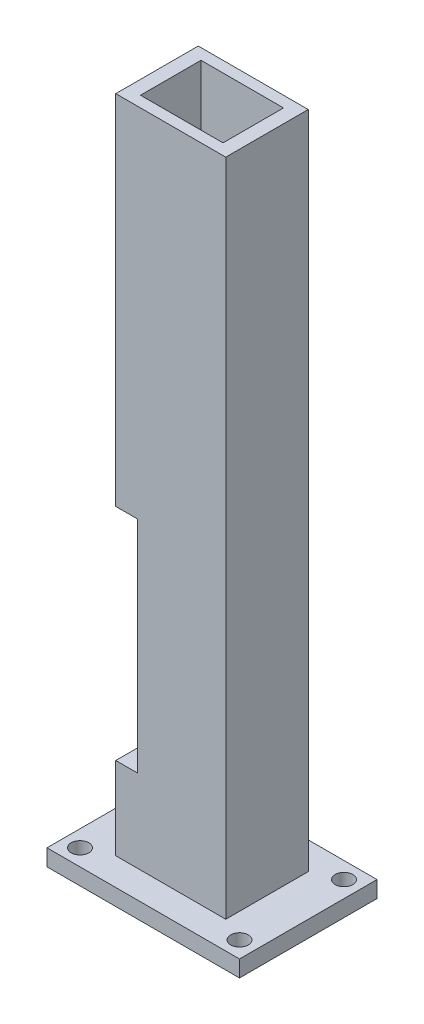
ISO-10303-21;
HEADER;
FILE_DESCRIPTION(('STEP AP214'),'2;1');
FILE_NAME('part.step','',(''),(''),'','','');
FILE_SCHEMA(('AUTOMOTIVE_DESIGN { 1 0 10303 214 1 1 1 1 }'));
ENDSEC;
DATA;
#1=APPLICATION_CONTEXT('core data for automotive mechanical design processes');
#2=APPLICATION_PROTOCOL_DEFINITION('international standard','automotive_design',2000,#1);
#3=PRODUCT_CONTEXT('',#1,'mechanical');
#4=PRODUCT('Part','Part','',(#3));
#5=PRODUCT_RELATED_PRODUCT_CATEGORY('part','',(#4));
#6=PRODUCT_DEFINITION_FORMATION('','',#4);
#7=PRODUCT_DEFINITION_CONTEXT('part definition',#1,'design');
#8=PRODUCT_DEFINITION('design','',#6,#7);
#9=PRODUCT_DEFINITION_SHAPE('','',#8);
#10=(LENGTH_UNIT() NAMED_UNIT(*) SI_UNIT(.MILLI.,.METRE.));
#11=(NAMED_UNIT(*) PLANE_ANGLE_UNIT() SI_UNIT($,.RADIAN.));
#12=(NAMED_UNIT(*) SI_UNIT($,.STERADIAN.) SOLID_ANGLE_UNIT());
#13=UNCERTAINTY_MEASURE_WITH_UNIT(LENGTH_MEASURE(1.E-05),#10,'distance_accuracy_value','');
#14=(GEOMETRIC_REPRESENTATION_CONTEXT(3) GLOBAL_UNCERTAINTY_ASSIGNED_CONTEXT((#13)) GLOBAL_UNIT_ASSIGNED_CONTEXT((#10,
#11,#12)) REPRESENTATION_CONTEXT('',''));
#15=CARTESIAN_POINT('',(0.,0.,0.));
#16=DIRECTION('',(0.,0.,1.));
#17=DIRECTION('',(1.,0.,0.));
#18=AXIS2_PLACEMENT_3D('',#15,#16,#17);
#19=CARTESIAN_POINT('',(-10.,123.,7.5));
#20=DIRECTION('',(1.,0.,0.));
#21=DIRECTION('',(0.,0.,-1.));
#22=AXIS2_PLACEMENT_3D('',#19,#20,#21);
#23=PLANE('',#22);
#24=DIRECTION('',(0.,-1.,0.));
#25=VECTOR('',#24,1.);
#26=CARTESIAN_POINT('',(-10.,123.,-7.5));
#27=LINE('',#26,#25);
#28=CARTESIAN_POINT('',(-10.,123.,-7.5));
#29=VERTEX_POINT('',#28);
#30=CARTESIAN_POINT('',(-10.,58.,-7.5));
#31=VERTEX_POINT('',#30);
#32=EDGE_CURVE('E201',#29,#31,#27,.T.);
#33=ORIENTED_EDGE('',*,*,#32,.T.);
#34=DIRECTION('',(0.,0.,1.));
#35=VECTOR('',#34,1.);
#36=CARTESIAN_POINT('',(-10.,58.,-12.501));
#37=LINE('',#36,#35);
#38=CARTESIAN_POINT('',(-10.,58.,7.5));
#39=VERTEX_POINT('',#38);
#40=EDGE_CURVE('E579',#31,#39,#37,.T.);
#41=ORIENTED_EDGE('',*,*,#40,.T.);
#42=DIRECTION('',(0.,-1.,0.));
#43=VECTOR('',#42,1.);
#44=CARTESIAN_POINT('',(-10.,123.,7.5));
#45=LINE('',#44,#43);
#46=CARTESIAN_POINT('',(-10.,123.,7.5));
#47=VERTEX_POINT('',#46);
#48=EDGE_CURVE('E202',#47,#39,#45,.T.);
#49=ORIENTED_EDGE('',*,*,#48,.F.);
#50=DIRECTION('',(0.,0.,1.));
#51=VECTOR('',#50,1.);
#52=CARTESIAN_POINT('',(-10.,123.,7.5));
#53=LINE('',#52,#51);
#54=EDGE_CURVE('E632',#29,#47,#53,.T.);
#55=ORIENTED_EDGE('',*,*,#54,.F.);
#56=EDGE_LOOP('',(#33,#41,#49,#55));
#57=FACE_BOUND('',#56,.T.);
#58=ADVANCED_FACE('F41',(#57),#23,.F.);
#59=CARTESIAN_POINT('',(-7.5,-0.001000000000001,5.5));
#60=DIRECTION('',(-1.,0.,0.));
#61=DIRECTION('',(0.,0.,1.));
#62=AXIS2_PLACEMENT_3D('',#59,#60,#61);
#63=PLANE('',#62);
#64=DIRECTION('',(0.,1.,0.));
#65=VECTOR('',#64,1.);
#66=CARTESIAN_POINT('',(-7.5,-0.001000000000001,5.5));
#67=LINE('',#66,#65);
#68=CARTESIAN_POINT('',(-7.5,58.,5.5));
#69=VERTEX_POINT('',#68);
#70=CARTESIAN_POINT('',(-7.5,123.,5.5));
#71=VERTEX_POINT('',#70);
#72=EDGE_CURVE('E616',#69,#71,#67,.T.);
#73=ORIENTED_EDGE('',*,*,#72,.F.);
#74=DIRECTION('',(0.,0.,1.));
#75=VECTOR('',#74,1.);
#76=CARTESIAN_POINT('',(-7.5,58.,-12.501));
#77=LINE('',#76,#75);
#78=CARTESIAN_POINT('',(-7.5,58.,-5.5));
#79=VERTEX_POINT('',#78);
#80=EDGE_CURVE('E560',#79,#69,#77,.T.);
#81=ORIENTED_EDGE('',*,*,#80,.F.);
#82=DIRECTION('',(0.,1.,0.));
#83=VECTOR('',#82,1.);
#84=CARTESIAN_POINT('',(-7.5,-0.001000000000001,-5.5));
#85=LINE('',#84,#83);
#86=CARTESIAN_POINT('',(-7.5,123.,-5.5));
#87=VERTEX_POINT('',#86);
#88=EDGE_CURVE('E620',#79,#87,#85,.T.);
#89=ORIENTED_EDGE('',*,*,#88,.T.);
#90=DIRECTION('',(0.,0.,1.));
#91=VECTOR('',#90,1.);
#92=CARTESIAN_POINT('',(-7.5,123.,5.5));
#93=LINE('',#92,#91);
#94=EDGE_CURVE('E603',#87,#71,#93,.T.);
#95=ORIENTED_EDGE('',*,*,#94,.T.);
#96=EDGE_LOOP('',(#73,#81,#89,#95));
#97=FACE_BOUND('',#96,.T.);
#98=ADVANCED_FACE('F264',(#97),#63,.F.);
#99=CARTESIAN_POINT('',(0.,3.,0.));
#100=DIRECTION('',(0.,-1.,0.));
#101=DIRECTION('',(0.,0.,-1.));
#102=AXIS2_PLACEMENT_3D('',#99,#100,#101);
#103=PLANE('',#102);
#104=CARTESIAN_POINT('',(14.5,3.,-9.50000000000001));
#105=DIRECTION('',(0.,1.,0.));
#106=DIRECTION('',(0.,0.,1.));
#107=AXIS2_PLACEMENT_3D('',#104,#105,#106);
#108=CIRCLE('',#107,1.6);
#109=CARTESIAN_POINT('',(14.5,3.,-7.90000000000001));
#110=VERTEX_POINT('',#109);
#111=EDGE_CURVE('E537',#110,#110,#108,.T.);
#112=ORIENTED_EDGE('',*,*,#111,.F.);
#113=EDGE_LOOP('',(#112));
#114=FACE_BOUND('',#113,.T.);
#115=CARTESIAN_POINT('',(-14.5,3.,9.5));
#116=DIRECTION('',(0.,1.,0.));
#117=DIRECTION('',(0.,0.,1.));
#118=AXIS2_PLACEMENT_3D('',#115,#116,#117);
#119=CIRCLE('',#118,1.6);
#120=CARTESIAN_POINT('',(-14.5,3.,11.1));
#121=VERTEX_POINT('',#120);
#122=EDGE_CURVE('E543',#121,#121,#119,.T.);
#123=ORIENTED_EDGE('',*,*,#122,.F.);
#124=EDGE_LOOP('',(#123));
#125=FACE_BOUND('',#124,.T.);
#126=CARTESIAN_POINT('',(14.5,3.,9.5));
#127=DIRECTION('',(0.,1.,0.));
#128=DIRECTION('',(0.,0.,1.));
#129=AXIS2_PLACEMENT_3D('',#126,#127,#128);
#130=CIRCLE('',#129,1.6);
#131=CARTESIAN_POINT('',(14.5,3.,11.1));
#132=VERTEX_POINT('',#131);
#133=EDGE_CURVE('E681',#132,#132,#130,.T.);
#134=ORIENTED_EDGE('',*,*,#133,.F.);
#135=EDGE_LOOP('',(#134));
#136=FACE_BOUND('',#135,.T.);
#137=CARTESIAN_POINT('',(-14.5,3.,-9.5));
#138=DIRECTION('',(0.,1.,0.));
#139=DIRECTION('',(0.,0.,1.));
#140=AXIS2_PLACEMENT_3D('',#137,#138,#139);
#141=CIRCLE('',#140,1.6);
#142=CARTESIAN_POINT('',(-14.5,3.,-7.9));
#143=VERTEX_POINT('',#142);
#144=EDGE_CURVE('E550',#143,#143,#141,.T.);
#145=ORIENTED_EDGE('',*,*,#144,.F.);
#146=EDGE_LOOP('',(#145));
#147=FACE_BOUND('',#146,.T.);
#148=DIRECTION('',(0.,0.,-1.));
#149=VECTOR('',#148,1.);
#150=CARTESIAN_POINT('',(17.5,3.,12.5));
#151=LINE('',#150,#149);
#152=CARTESIAN_POINT('',(17.5,3.,12.5));
#153=VERTEX_POINT('',#152);
#154=CARTESIAN_POINT('',(17.5,3.,-12.5));
#155=VERTEX_POINT('',#154);
#156=EDGE_CURVE('E212',#153,#155,#151,.T.);
#157=ORIENTED_EDGE('',*,*,#156,.T.);
#158=DIRECTION('',(-1.,0.,0.));
#159=VECTOR('',#158,1.);
#160=CARTESIAN_POINT('',(-17.5,3.,-12.5));
#161=LINE('',#160,#159);
#162=CARTESIAN_POINT('',(-17.5,3.,-12.5));
#163=VERTEX_POINT('',#162);
#164=EDGE_CURVE('E215',#155,#163,#161,.T.);
#165=ORIENTED_EDGE('',*,*,#164,.T.);
#166=DIRECTION('',(0.,0.,1.));
#167=VECTOR('',#166,1.);
#168=CARTESIAN_POINT('',(-17.5,3.,12.5));
#169=LINE('',#168,#167);
#170=CARTESIAN_POINT('',(-17.5,3.,12.5));
#171=VERTEX_POINT('',#170);
#172=EDGE_CURVE('E218',#163,#171,#169,.T.);
#173=ORIENTED_EDGE('',*,*,#172,.T.);
#174=DIRECTION('',(1.,0.,0.));
#175=VECTOR('',#174,1.);
#176=CARTESIAN_POINT('',(-17.5,3.,12.5));
#177=LINE('',#176,#175);
#178=EDGE_CURVE('E220',#171,#153,#177,.T.);
#179=ORIENTED_EDGE('',*,*,#178,.T.);
#180=EDGE_LOOP('',(#157,#165,#173,#179));
#181=FACE_BOUND('',#180,.T.);
#182=DIRECTION('',(0.,0.,-1.));
#183=VECTOR('',#182,1.);
#184=CARTESIAN_POINT('',(10.,3.,7.5));
#185=LINE('',#184,#183);
#186=CARTESIAN_POINT('',(10.,3.,7.5));
#187=VERTEX_POINT('',#186);
#188=CARTESIAN_POINT('',(10.,3.,-7.5));
#189=VERTEX_POINT('',#188);
#190=EDGE_CURVE('E625',#187,#189,#185,.T.);
#191=ORIENTED_EDGE('',*,*,#190,.F.);
#192=DIRECTION('',(1.,0.,0.));
#193=VECTOR('',#192,1.);
#194=CARTESIAN_POINT('',(-10.,3.,7.5));
#195=LINE('',#194,#193);
#196=CARTESIAN_POINT('',(-10.,3.,7.5));
#197=VERTEX_POINT('',#196);
#198=EDGE_CURVE('E630',#197,#187,#195,.T.);
#199=ORIENTED_EDGE('',*,*,#198,.F.);
#200=DIRECTION('',(0.,0.,1.));
#201=VECTOR('',#200,1.);
#202=CARTESIAN_POINT('',(-10.,3.,7.5));
#203=LINE('',#202,#201);
#204=CARTESIAN_POINT('',(-10.,3.,-7.5));
#205=VERTEX_POINT('',#204);
#206=EDGE_CURVE('E640',#205,#197,#203,.T.);
#207=ORIENTED_EDGE('',*,*,#206,.F.);
#208=DIRECTION('',(-1.,0.,0.));
#209=VECTOR('',#208,1.);
#210=CARTESIAN_POINT('',(-10.,3.,-7.5));
#211=LINE('',#210,#209);
#212=EDGE_CURVE('E200',#189,#205,#211,.T.);
#213=ORIENTED_EDGE('',*,*,#212,.F.);
#214=EDGE_LOOP('',(#191,#199,#207,#213));
#215=FACE_BOUND('',#214,.T.);
#216=ADVANCED_FACE('F254',(#114,#125,#136,#147,#181,#215),#103,.F.);
#217=CARTESIAN_POINT('',(17.5,3.,12.5));
#218=DIRECTION('',(-1.,0.,0.));
#219=DIRECTION('',(0.,0.,1.));
#220=AXIS2_PLACEMENT_3D('',#217,#218,#219);
#221=PLANE('',#220);
#222=DIRECTION('',(0.,0.,-1.));
#223=VECTOR('',#222,1.);
#224=CARTESIAN_POINT('',(17.5,0.,12.5));
#225=LINE('',#224,#223);
#226=CARTESIAN_POINT('',(17.5,0.,12.5));
#227=VERTEX_POINT('',#226);
#228=CARTESIAN_POINT('',(17.5,0.,-12.5));
#229=VERTEX_POINT('',#228);
#230=EDGE_CURVE('E211',#227,#229,#225,.T.);
#231=ORIENTED_EDGE('',*,*,#230,.T.);
#232=DIRECTION('',(0.,-1.,0.));
#233=VECTOR('',#232,1.);
#234=CARTESIAN_POINT('',(17.5,3.,-12.5));
#235=LINE('',#234,#233);
#236=EDGE_CURVE('E11',#155,#229,#235,.T.);
#237=ORIENTED_EDGE('',*,*,#236,.F.);
#238=ORIENTED_EDGE('',*,*,#156,.F.);
#239=DIRECTION('',(0.,-1.,0.));
#240=VECTOR('',#239,1.);
#241=CARTESIAN_POINT('',(17.5,3.,12.5));
#242=LINE('',#241,#240);
#243=EDGE_CURVE('E222',#153,#227,#242,.T.);
#244=ORIENTED_EDGE('',*,*,#243,.T.);
#245=EDGE_LOOP('',(#231,#237,#238,#244));
#246=FACE_BOUND('',#245,.T.);
#247=ADVANCED_FACE('F43',(#246),#221,.F.);
#248=CARTESIAN_POINT('',(-17.5,3.,-12.5));
#249=DIRECTION('',(0.,0.,1.));
#250=DIRECTION('',(1.,0.,0.));
#251=AXIS2_PLACEMENT_3D('',#248,#249,#250);
#252=PLANE('',#251);
#253=DIRECTION('',(-1.,0.,0.));
#254=VECTOR('',#253,1.);
#255=CARTESIAN_POINT('',(-17.5,0.,-12.5));
#256=LINE('',#255,#254);
#257=CARTESIAN_POINT('',(-17.5,0.,-12.5));
#258=VERTEX_POINT('',#257);
#259=EDGE_CURVE('E225',#229,#258,#256,.T.);
#260=ORIENTED_EDGE('',*,*,#259,.T.);
#261=DIRECTION('',(0.,-1.,0.));
#262=VECTOR('',#261,1.);
#263=CARTESIAN_POINT('',(-17.5,3.,-12.5));
#264=LINE('',#263,#262);
#265=EDGE_CURVE('E49',#163,#258,#264,.T.);
#266=ORIENTED_EDGE('',*,*,#265,.F.);
#267=ORIENTED_EDGE('',*,*,#164,.F.);
#268=ORIENTED_EDGE('',*,*,#236,.T.);
#269=EDGE_LOOP('',(#260,#266,#267,#268));
#270=FACE_BOUND('',#269,.T.);
#271=ADVANCED_FACE('F256',(#270),#252,.F.);
#272=CARTESIAN_POINT('',(-17.5,3.,12.5));
#273=DIRECTION('',(1.,0.,0.));
#274=DIRECTION('',(0.,0.,-1.));
#275=AXIS2_PLACEMENT_3D('',#272,#273,#274);
#276=PLANE('',#275);
#277=DIRECTION('',(0.,0.,1.));
#278=VECTOR('',#277,1.);
#279=CARTESIAN_POINT('',(-17.5,0.,12.5));
#280=LINE('',#279,#278);
#281=CARTESIAN_POINT('',(-17.5,0.,12.5));
#282=VERTEX_POINT('',#281);
#283=EDGE_CURVE('E227',#258,#282,#280,.T.);
#284=ORIENTED_EDGE('',*,*,#283,.T.);
#285=DIRECTION('',(0.,-1.,0.));
#286=VECTOR('',#285,1.);
#287=CARTESIAN_POINT('',(-17.5,3.,12.5));
#288=LINE('',#287,#286);
#289=EDGE_CURVE('E232',#171,#282,#288,.T.);
#290=ORIENTED_EDGE('',*,*,#289,.F.);
#291=ORIENTED_EDGE('',*,*,#172,.F.);
#292=ORIENTED_EDGE('',*,*,#265,.T.);
#293=EDGE_LOOP('',(#284,#290,#291,#292));
#294=FACE_BOUND('',#293,.T.);
#295=ADVANCED_FACE('F239',(#294),#276,.F.);
#296=CARTESIAN_POINT('',(-17.5,3.,12.5));
#297=DIRECTION('',(0.,0.,-1.));
#298=DIRECTION('',(-1.,0.,0.));
#299=AXIS2_PLACEMENT_3D('',#296,#297,#298);
#300=PLANE('',#299);
#301=DIRECTION('',(1.,0.,0.));
#302=VECTOR('',#301,1.);
#303=CARTESIAN_POINT('',(-17.5,0.,12.5));
#304=LINE('',#303,#302);
#305=EDGE_CURVE('E216',#282,#227,#304,.T.);
#306=ORIENTED_EDGE('',*,*,#305,.T.);
#307=ORIENTED_EDGE('',*,*,#243,.F.);
#308=ORIENTED_EDGE('',*,*,#178,.F.);
#309=ORIENTED_EDGE('',*,*,#289,.T.);
#310=EDGE_LOOP('',(#306,#307,#308,#309));
#311=FACE_BOUND('',#310,.T.);
#312=ADVANCED_FACE('F248',(#311),#300,.F.);
#313=CARTESIAN_POINT('',(0.,0.,0.));
#314=DIRECTION('',(0.,-1.,0.));
#315=DIRECTION('',(0.,0.,-1.));
#316=AXIS2_PLACEMENT_3D('',#313,#314,#315);
#317=PLANE('',#316);
#318=CARTESIAN_POINT('',(14.5,0.,-9.50000000000001));
#319=DIRECTION('',(0.,-1.,0.));
#320=DIRECTION('',(0.,0.,-1.));
#321=AXIS2_PLACEMENT_3D('',#318,#319,#320);
#322=CIRCLE('',#321,1.6);
#323=CARTESIAN_POINT('',(14.5,0.,-7.90000000000001));
#324=VERTEX_POINT('',#323);
#325=EDGE_CURVE('E534',#324,#324,#322,.F.);
#326=ORIENTED_EDGE('',*,*,#325,.T.);
#327=EDGE_LOOP('',(#326));
#328=FACE_BOUND('',#327,.T.);
#329=CARTESIAN_POINT('',(-14.5,0.,9.5));
#330=DIRECTION('',(0.,-1.,0.));
#331=DIRECTION('',(0.,0.,-1.));
#332=AXIS2_PLACEMENT_3D('',#329,#330,#331);
#333=CIRCLE('',#332,1.6);
#334=CARTESIAN_POINT('',(-14.5,0.,11.1));
#335=VERTEX_POINT('',#334);
#336=EDGE_CURVE('E538',#335,#335,#333,.F.);
#337=ORIENTED_EDGE('',*,*,#336,.T.);
#338=EDGE_LOOP('',(#337));
#339=FACE_BOUND('',#338,.T.);
#340=CARTESIAN_POINT('',(14.5,0.,9.5));
#341=DIRECTION('',(0.,-1.,0.));
#342=DIRECTION('',(0.,0.,-1.));
#343=AXIS2_PLACEMENT_3D('',#340,#341,#342);
#344=CIRCLE('',#343,1.6);
#345=CARTESIAN_POINT('',(14.5,0.,11.1));
#346=VERTEX_POINT('',#345);
#347=EDGE_CURVE('E549',#346,#346,#344,.F.);
#348=ORIENTED_EDGE('',*,*,#347,.T.);
#349=EDGE_LOOP('',(#348));
#350=FACE_BOUND('',#349,.T.);
#351=CARTESIAN_POINT('',(-14.5,0.,-9.5));
#352=DIRECTION('',(0.,-1.,0.));
#353=DIRECTION('',(0.,0.,-1.));
#354=AXIS2_PLACEMENT_3D('',#351,#352,#353);
#355=CIRCLE('',#354,1.6);
#356=CARTESIAN_POINT('',(-14.5,0.,-7.9));
#357=VERTEX_POINT('',#356);
#358=EDGE_CURVE('E540',#357,#357,#355,.F.);
#359=ORIENTED_EDGE('',*,*,#358,.T.);
#360=EDGE_LOOP('',(#359));
#361=FACE_BOUND('',#360,.T.);
#362=DIRECTION('',(0.,0.,-1.));
#363=VECTOR('',#362,1.);
#364=CARTESIAN_POINT('',(7.5,0.,5.5));
#365=LINE('',#364,#363);
#366=CARTESIAN_POINT('',(7.5,0.,5.5));
#367=VERTEX_POINT('',#366);
#368=CARTESIAN_POINT('',(7.5,0.,-5.5));
#369=VERTEX_POINT('',#368);
#370=EDGE_CURVE('E595',#367,#369,#365,.T.);
#371=ORIENTED_EDGE('',*,*,#370,.T.);
#372=DIRECTION('',(-1.,0.,0.));
#373=VECTOR('',#372,1.);
#374=CARTESIAN_POINT('',(-7.5,0.,-5.5));
#375=LINE('',#374,#373);
#376=CARTESIAN_POINT('',(-7.5,0.,-5.5));
#377=VERTEX_POINT('',#376);
#378=EDGE_CURVE('E612',#369,#377,#375,.T.);
#379=ORIENTED_EDGE('',*,*,#378,.T.);
#380=DIRECTION('',(0.,0.,1.));
#381=VECTOR('',#380,1.);
#382=CARTESIAN_POINT('',(-7.5,0.,5.5));
#383=LINE('',#382,#381);
#384=CARTESIAN_POINT('',(-7.5,0.,5.5));
#385=VERTEX_POINT('',#384);
#386=EDGE_CURVE('E184',#377,#385,#383,.T.);
#387=ORIENTED_EDGE('',*,*,#386,.T.);
#388=DIRECTION('',(1.,0.,0.));
#389=VECTOR('',#388,1.);
#390=CARTESIAN_POINT('',(-7.5,0.,5.5));
#391=LINE('',#390,#389);
#392=EDGE_CURVE('E592',#385,#367,#391,.T.);
#393=ORIENTED_EDGE('',*,*,#392,.T.);
#394=EDGE_LOOP('',(#371,#379,#387,#393));
#395=FACE_BOUND('',#394,.T.);
#396=ORIENTED_EDGE('',*,*,#230,.F.);
#397=ORIENTED_EDGE('',*,*,#305,.F.);
#398=ORIENTED_EDGE('',*,*,#283,.F.);
#399=ORIENTED_EDGE('',*,*,#259,.F.);
#400=EDGE_LOOP('',(#396,#397,#398,#399));
#401=FACE_BOUND('',#400,.T.);
#402=ADVANCED_FACE('F245',(#328,#339,#350,#361,#395,#401),#317,.T.);
#403=CARTESIAN_POINT('',(10.,123.,7.5));
#404=DIRECTION('',(-1.,0.,0.));
#405=DIRECTION('',(0.,0.,1.));
#406=AXIS2_PLACEMENT_3D('',#403,#404,#405);
#407=PLANE('',#406);
#408=ORIENTED_EDGE('',*,*,#190,.T.);
#409=DIRECTION('',(0.,-1.,0.));
#410=VECTOR('',#409,1.);
#411=CARTESIAN_POINT('',(10.,123.,-7.5));
#412=LINE('',#411,#410);
#413=CARTESIAN_POINT('',(10.,123.,-7.5));
#414=VERTEX_POINT('',#413);
#415=EDGE_CURVE('E205',#414,#189,#412,.T.);
#416=ORIENTED_EDGE('',*,*,#415,.F.);
#417=DIRECTION('',(0.,0.,-1.));
#418=VECTOR('',#417,1.);
#419=CARTESIAN_POINT('',(10.,123.,7.5));
#420=LINE('',#419,#418);
#421=CARTESIAN_POINT('',(10.,123.,7.5));
#422=VERTEX_POINT('',#421);
#423=EDGE_CURVE('E626',#422,#414,#420,.T.);
#424=ORIENTED_EDGE('',*,*,#423,.F.);
#425=DIRECTION('',(0.,-1.,0.));
#426=VECTOR('',#425,1.);
#427=CARTESIAN_POINT('',(10.,123.,7.5));
#428=LINE('',#427,#426);
#429=EDGE_CURVE('E636',#422,#187,#428,.T.);
#430=ORIENTED_EDGE('',*,*,#429,.T.);
#431=EDGE_LOOP('',(#408,#416,#424,#430));
#432=FACE_BOUND('',#431,.T.);
#433=ADVANCED_FACE('F283',(#432),#407,.F.);
#434=CARTESIAN_POINT('',(-10.,123.,-7.5));
#435=DIRECTION('',(0.,0.,1.));
#436=DIRECTION('',(1.,0.,0.));
#437=AXIS2_PLACEMENT_3D('',#434,#435,#436);
#438=PLANE('',#437);
#439=DIRECTION('',(0.,-1.,0.));
#440=VECTOR('',#439,1.);
#441=CARTESIAN_POINT('',(-6.,58.,-7.5));
#442=LINE('',#441,#440);
#443=CARTESIAN_POINT('',(-6.,58.,-7.5));
#444=VERTEX_POINT('',#443);
#445=CARTESIAN_POINT('',(-5.99999999999999,18.,-7.5));
#446=VERTEX_POINT('',#445);
#447=EDGE_CURVE('E568',#444,#446,#442,.T.);
#448=ORIENTED_EDGE('',*,*,#447,.F.);
#449=DIRECTION('',(1.,0.,0.));
#450=VECTOR('',#449,1.);
#451=CARTESIAN_POINT('',(-10.,58.,-7.5));
#452=LINE('',#451,#450);
#453=EDGE_CURVE('E570',#31,#444,#452,.T.);
#454=ORIENTED_EDGE('',*,*,#453,.F.);
#455=ORIENTED_EDGE('',*,*,#32,.F.);
#456=DIRECTION('',(-1.,0.,0.));
#457=VECTOR('',#456,1.);
#458=CARTESIAN_POINT('',(-10.,123.,-7.5));
#459=LINE('',#458,#457);
#460=EDGE_CURVE('E629',#414,#29,#459,.T.);
#461=ORIENTED_EDGE('',*,*,#460,.F.);
#462=ORIENTED_EDGE('',*,*,#415,.T.);
#463=ORIENTED_EDGE('',*,*,#212,.T.);
#464=CARTESIAN_POINT('',(-10.,18.,-7.5));
#465=VERTEX_POINT('',#464);
#466=EDGE_CURVE('E191',#465,#205,#27,.T.);
#467=ORIENTED_EDGE('',*,*,#466,.F.);
#468=DIRECTION('',(-1.,0.,0.));
#469=VECTOR('',#468,1.);
#470=CARTESIAN_POINT('',(-5.99999999999999,18.,-7.5));
#471=LINE('',#470,#469);
#472=EDGE_CURVE('E177',#446,#465,#471,.T.);
#473=ORIENTED_EDGE('',*,*,#472,.F.);
#474=EDGE_LOOP('',(#448,#454,#455,#461,#462,#463,#467,#473));
#475=FACE_BOUND('',#474,.T.);
#476=ADVANCED_FACE('F198',(#475),#438,.F.);
#477=CARTESIAN_POINT('',(-10.,18.,7.5));
#478=VERTEX_POINT('',#477);
#479=EDGE_CURVE('E193',#478,#197,#45,.T.);
#480=ORIENTED_EDGE('',*,*,#479,.F.);
#481=DIRECTION('',(0.,0.,1.));
#482=VECTOR('',#481,1.);
#483=CARTESIAN_POINT('',(-10.,18.,-12.501));
#484=LINE('',#483,#482);
#485=EDGE_CURVE('E56',#465,#478,#484,.T.);
#486=ORIENTED_EDGE('',*,*,#485,.F.);
#487=ORIENTED_EDGE('',*,*,#466,.T.);
#488=ORIENTED_EDGE('',*,*,#206,.T.);
#489=EDGE_LOOP('',(#480,#486,#487,#488));
#490=FACE_BOUND('',#489,.T.);
#491=ADVANCED_FACE('F189',(#490),#23,.F.);
#492=CARTESIAN_POINT('',(-10.,123.,7.5));
#493=DIRECTION('',(0.,0.,-1.));
#494=DIRECTION('',(-1.,0.,0.));
#495=AXIS2_PLACEMENT_3D('',#492,#493,#494);
#496=PLANE('',#495);
#497=ORIENTED_EDGE('',*,*,#48,.T.);
#498=DIRECTION('',(-1.,0.,0.));
#499=VECTOR('',#498,1.);
#500=CARTESIAN_POINT('',(-10.,58.,7.5));
#501=LINE('',#500,#499);
#502=CARTESIAN_POINT('',(-6.,58.,7.5));
#503=VERTEX_POINT('',#502);
#504=EDGE_CURVE('E195',#503,#39,#501,.T.);
#505=ORIENTED_EDGE('',*,*,#504,.F.);
#506=DIRECTION('',(0.,1.,0.));
#507=VECTOR('',#506,1.);
#508=CARTESIAN_POINT('',(-6.,58.,7.5));
#509=LINE('',#508,#507);
#510=CARTESIAN_POINT('',(-5.99999999999999,18.,7.5));
#511=VERTEX_POINT('',#510);
#512=EDGE_CURVE('E575',#511,#503,#509,.T.);
#513=ORIENTED_EDGE('',*,*,#512,.F.);
#514=DIRECTION('',(1.,0.,0.));
#515=VECTOR('',#514,1.);
#516=CARTESIAN_POINT('',(-5.99999999999999,18.,7.5));
#517=LINE('',#516,#515);
#518=EDGE_CURVE('E573',#478,#511,#517,.T.);
#519=ORIENTED_EDGE('',*,*,#518,.F.);
#520=ORIENTED_EDGE('',*,*,#479,.T.);
#521=ORIENTED_EDGE('',*,*,#198,.T.);
#522=ORIENTED_EDGE('',*,*,#429,.F.);
#523=DIRECTION('',(1.,0.,0.));
#524=VECTOR('',#523,1.);
#525=CARTESIAN_POINT('',(-10.,123.,7.5));
#526=LINE('',#525,#524);
#527=EDGE_CURVE('E634',#47,#422,#526,.T.);
#528=ORIENTED_EDGE('',*,*,#527,.F.);
#529=EDGE_LOOP('',(#497,#505,#513,#519,#520,#521,#522,#528));
#530=FACE_BOUND('',#529,.T.);
#531=ADVANCED_FACE('F276',(#530),#496,.F.);
#532=CARTESIAN_POINT('',(0.,123.,0.));
#533=DIRECTION('',(0.,-1.,0.));
#534=DIRECTION('',(0.,0.,-1.));
#535=AXIS2_PLACEMENT_3D('',#532,#533,#534);
#536=PLANE('',#535);
#537=DIRECTION('',(-1.,0.,0.));
#538=VECTOR('',#537,1.);
#539=CARTESIAN_POINT('',(-7.5,123.,-5.5));
#540=LINE('',#539,#538);
#541=CARTESIAN_POINT('',(7.5,123.,-5.5));
#542=VERTEX_POINT('',#541);
#543=EDGE_CURVE('E600',#542,#87,#540,.T.);
#544=ORIENTED_EDGE('',*,*,#543,.F.);
#545=DIRECTION('',(0.,0.,-1.));
#546=VECTOR('',#545,1.);
#547=CARTESIAN_POINT('',(7.5,123.,5.5));
#548=LINE('',#547,#546);
#549=CARTESIAN_POINT('',(7.5,123.,5.5));
#550=VERTEX_POINT('',#549);
#551=EDGE_CURVE('E598',#550,#542,#548,.T.);
#552=ORIENTED_EDGE('',*,*,#551,.F.);
#553=DIRECTION('',(1.,0.,0.));
#554=VECTOR('',#553,1.);
#555=CARTESIAN_POINT('',(-7.5,123.,5.5));
#556=LINE('',#555,#554);
#557=EDGE_CURVE('E606',#71,#550,#556,.T.);
#558=ORIENTED_EDGE('',*,*,#557,.F.);
#559=ORIENTED_EDGE('',*,*,#94,.F.);
#560=EDGE_LOOP('',(#544,#552,#558,#559));
#561=FACE_BOUND('',#560,.T.);
#562=ORIENTED_EDGE('',*,*,#423,.T.);
#563=ORIENTED_EDGE('',*,*,#460,.T.);
#564=ORIENTED_EDGE('',*,*,#54,.T.);
#565=ORIENTED_EDGE('',*,*,#527,.T.);
#566=EDGE_LOOP('',(#562,#563,#564,#565));
#567=FACE_BOUND('',#566,.T.);
#568=ADVANCED_FACE('F281',(#561,#567),#536,.F.);
#569=CARTESIAN_POINT('',(7.5,-0.001000000000001,5.5));
#570=DIRECTION('',(1.,0.,0.));
#571=DIRECTION('',(0.,0.,-1.));
#572=AXIS2_PLACEMENT_3D('',#569,#570,#571);
#573=PLANE('',#572);
#574=DIRECTION('',(0.,1.,0.));
#575=VECTOR('',#574,1.);
#576=CARTESIAN_POINT('',(7.5,-0.001000000000001,5.5));
#577=LINE('',#576,#575);
#578=EDGE_CURVE('E610',#367,#550,#577,.T.);
#579=ORIENTED_EDGE('',*,*,#578,.T.);
#580=ORIENTED_EDGE('',*,*,#551,.T.);
#581=DIRECTION('',(0.,1.,0.));
#582=VECTOR('',#581,1.);
#583=CARTESIAN_POINT('',(7.5,-0.001000000000001,-5.5));
#584=LINE('',#583,#582);
#585=EDGE_CURVE('E609',#369,#542,#584,.T.);
#586=ORIENTED_EDGE('',*,*,#585,.F.);
#587=ORIENTED_EDGE('',*,*,#370,.F.);
#588=EDGE_LOOP('',(#579,#580,#586,#587));
#589=FACE_BOUND('',#588,.T.);
#590=ADVANCED_FACE('F323',(#589),#573,.F.);
#591=CARTESIAN_POINT('',(-7.5,-0.001000000000001,5.5));
#592=DIRECTION('',(0.,0.,1.));
#593=DIRECTION('',(1.,0.,0.));
#594=AXIS2_PLACEMENT_3D('',#591,#592,#593);
#595=PLANE('',#594);
#596=DIRECTION('',(0.,-1.,0.));
#597=VECTOR('',#596,1.);
#598=CARTESIAN_POINT('',(-6.,58.,5.5));
#599=LINE('',#598,#597);
#600=CARTESIAN_POINT('',(-6.,58.,5.5));
#601=VERTEX_POINT('',#600);
#602=CARTESIAN_POINT('',(-5.99999999999999,18.,5.5));
#603=VERTEX_POINT('',#602);
#604=EDGE_CURVE('E562',#601,#603,#599,.T.);
#605=ORIENTED_EDGE('',*,*,#604,.F.);
#606=DIRECTION('',(1.,0.,0.));
#607=VECTOR('',#606,1.);
#608=CARTESIAN_POINT('',(-10.,58.,5.5));
#609=LINE('',#608,#607);
#610=EDGE_CURVE('E565',#69,#601,#609,.T.);
#611=ORIENTED_EDGE('',*,*,#610,.F.);
#612=ORIENTED_EDGE('',*,*,#72,.T.);
#613=ORIENTED_EDGE('',*,*,#557,.T.);
#614=ORIENTED_EDGE('',*,*,#578,.F.);
#615=ORIENTED_EDGE('',*,*,#392,.F.);
#616=CARTESIAN_POINT('',(-7.5,18.,5.5));
#617=VERTEX_POINT('',#616);
#618=EDGE_CURVE('E613',#385,#617,#67,.T.);
#619=ORIENTED_EDGE('',*,*,#618,.T.);
#620=DIRECTION('',(-1.,0.,0.));
#621=VECTOR('',#620,1.);
#622=CARTESIAN_POINT('',(-5.99999999999999,18.,5.5));
#623=LINE('',#622,#621);
#624=EDGE_CURVE('E185',#603,#617,#623,.T.);
#625=ORIENTED_EDGE('',*,*,#624,.F.);
#626=EDGE_LOOP('',(#605,#611,#612,#613,#614,#615,#619,#625));
#627=FACE_BOUND('',#626,.T.);
#628=ADVANCED_FACE('F334',(#627),#595,.F.);
#629=CARTESIAN_POINT('',(-7.5,18.,-5.5));
#630=VERTEX_POINT('',#629);
#631=EDGE_CURVE('E617',#377,#630,#85,.T.);
#632=ORIENTED_EDGE('',*,*,#631,.T.);
#633=DIRECTION('',(0.,0.,-1.));
#634=VECTOR('',#633,1.);
#635=CARTESIAN_POINT('',(-7.5,18.,-12.501));
#636=LINE('',#635,#634);
#637=EDGE_CURVE('E63',#617,#630,#636,.T.);
#638=ORIENTED_EDGE('',*,*,#637,.F.);
#639=ORIENTED_EDGE('',*,*,#618,.F.);
#640=ORIENTED_EDGE('',*,*,#386,.F.);
#641=EDGE_LOOP('',(#632,#638,#639,#640));
#642=FACE_BOUND('',#641,.T.);
#643=ADVANCED_FACE('F272',(#642),#63,.F.);
#644=CARTESIAN_POINT('',(-7.5,-0.001000000000001,-5.5));
#645=DIRECTION('',(0.,0.,-1.));
#646=DIRECTION('',(-1.,0.,0.));
#647=AXIS2_PLACEMENT_3D('',#644,#645,#646);
#648=PLANE('',#647);
#649=ORIENTED_EDGE('',*,*,#88,.F.);
#650=DIRECTION('',(-1.,0.,0.));
#651=VECTOR('',#650,1.);
#652=CARTESIAN_POINT('',(-10.,58.,-5.5));
#653=LINE('',#652,#651);
#654=CARTESIAN_POINT('',(-6.,58.,-5.5));
#655=VERTEX_POINT('',#654);
#656=EDGE_CURVE('E558',#655,#79,#653,.T.);
#657=ORIENTED_EDGE('',*,*,#656,.F.);
#658=DIRECTION('',(0.,1.,0.));
#659=VECTOR('',#658,1.);
#660=CARTESIAN_POINT('',(-6.,58.,-5.5));
#661=LINE('',#660,#659);
#662=CARTESIAN_POINT('',(-5.99999999999999,18.,-5.5));
#663=VERTEX_POINT('',#662);
#664=EDGE_CURVE('E553',#663,#655,#661,.T.);
#665=ORIENTED_EDGE('',*,*,#664,.F.);
#666=DIRECTION('',(1.,0.,0.));
#667=VECTOR('',#666,1.);
#668=CARTESIAN_POINT('',(-5.99999999999999,18.,-5.5));
#669=LINE('',#668,#667);
#670=EDGE_CURVE('E582',#630,#663,#669,.T.);
#671=ORIENTED_EDGE('',*,*,#670,.F.);
#672=ORIENTED_EDGE('',*,*,#631,.F.);
#673=ORIENTED_EDGE('',*,*,#378,.F.);
#674=ORIENTED_EDGE('',*,*,#585,.T.);
#675=ORIENTED_EDGE('',*,*,#543,.T.);
#676=EDGE_LOOP('',(#649,#657,#665,#671,#672,#673,#674,#675));
#677=FACE_BOUND('',#676,.T.);
#678=ADVANCED_FACE('F383',(#677),#648,.F.);
#679=CARTESIAN_POINT('',(-10.,58.,-12.501));
#680=DIRECTION('',(0.,1.,0.));
#681=DIRECTION('',(-1.,0.,0.));
#682=AXIS2_PLACEMENT_3D('',#679,#680,#681);
#683=PLANE('',#682);
#684=ORIENTED_EDGE('',*,*,#453,.T.);
#685=DIRECTION('',(0.,0.,1.));
#686=VECTOR('',#685,1.);
#687=CARTESIAN_POINT('',(-6.,58.,-12.501));
#688=LINE('',#687,#686);
#689=EDGE_CURVE('E583',#444,#655,#688,.T.);
#690=ORIENTED_EDGE('',*,*,#689,.T.);
#691=ORIENTED_EDGE('',*,*,#656,.T.);
#692=ORIENTED_EDGE('',*,*,#80,.T.);
#693=ORIENTED_EDGE('',*,*,#610,.T.);
#694=EDGE_CURVE('E584',#601,#503,#688,.T.);
#695=ORIENTED_EDGE('',*,*,#694,.T.);
#696=ORIENTED_EDGE('',*,*,#504,.T.);
#697=ORIENTED_EDGE('',*,*,#40,.F.);
#698=EDGE_LOOP('',(#684,#690,#691,#692,#693,#695,#696,#697));
#699=FACE_BOUND('',#698,.T.);
#700=ADVANCED_FACE('F393',(#699),#683,.F.);
#701=CARTESIAN_POINT('',(-6.,58.,-12.501));
#702=DIRECTION('',(1.,0.,0.));
#703=DIRECTION('',(0.,1.,0.));
#704=AXIS2_PLACEMENT_3D('',#701,#702,#703);
#705=PLANE('',#704);
#706=ORIENTED_EDGE('',*,*,#447,.T.);
#707=DIRECTION('',(0.,0.,1.));
#708=VECTOR('',#707,1.);
#709=CARTESIAN_POINT('',(-5.99999999999999,18.,-12.501));
#710=LINE('',#709,#708);
#711=EDGE_CURVE('E179',#446,#663,#710,.T.);
#712=ORIENTED_EDGE('',*,*,#711,.T.);
#713=ORIENTED_EDGE('',*,*,#664,.T.);
#714=ORIENTED_EDGE('',*,*,#689,.F.);
#715=EDGE_LOOP('',(#706,#712,#713,#714));
#716=FACE_BOUND('',#715,.T.);
#717=ADVANCED_FACE('F403',(#716),#705,.F.);
#718=ORIENTED_EDGE('',*,*,#604,.T.);
#719=EDGE_CURVE('E194',#603,#511,#710,.T.);
#720=ORIENTED_EDGE('',*,*,#719,.T.);
#721=ORIENTED_EDGE('',*,*,#512,.T.);
#722=ORIENTED_EDGE('',*,*,#694,.F.);
#723=EDGE_LOOP('',(#718,#720,#721,#722));
#724=FACE_BOUND('',#723,.T.);
#725=ADVANCED_FACE('F413',(#724),#705,.F.);
#726=CARTESIAN_POINT('',(-5.99999999999999,18.,-12.501));
#727=DIRECTION('',(0.,-1.,0.));
#728=DIRECTION('',(1.,0.,0.));
#729=AXIS2_PLACEMENT_3D('',#726,#727,#728);
#730=PLANE('',#729);
#731=ORIENTED_EDGE('',*,*,#472,.T.);
#732=ORIENTED_EDGE('',*,*,#485,.T.);
#733=ORIENTED_EDGE('',*,*,#518,.T.);
#734=ORIENTED_EDGE('',*,*,#719,.F.);
#735=ORIENTED_EDGE('',*,*,#624,.T.);
#736=ORIENTED_EDGE('',*,*,#637,.T.);
#737=ORIENTED_EDGE('',*,*,#670,.T.);
#738=ORIENTED_EDGE('',*,*,#711,.F.);
#739=EDGE_LOOP('',(#731,#732,#733,#734,#735,#736,#737,#738));
#740=FACE_BOUND('',#739,.T.);
#741=ADVANCED_FACE('F178',(#740),#730,.F.);
#742=CARTESIAN_POINT('',(-14.5,-0.00100000000000013,-9.5));
#743=DIRECTION('',(0.,1.,0.));
#744=DIRECTION('',(0.,0.,1.));
#745=AXIS2_PLACEMENT_3D('',#742,#743,#744);
#746=CYLINDRICAL_SURFACE('',#745,1.6);
#747=CARTESIAN_POINT('',(-14.5,0.,-7.9));
#748=CARTESIAN_POINT('',(-14.5,0.03125,-7.9));
#749=CARTESIAN_POINT('',(-14.5,0.0625,-7.9));
#750=CARTESIAN_POINT('',(-14.5,0.125,-7.9));
#751=CARTESIAN_POINT('',(-14.5,0.15625,-7.9));
#752=CARTESIAN_POINT('',(-14.5,0.21875,-7.9));
#753=CARTESIAN_POINT('',(-14.5,0.25,-7.9));
#754=CARTESIAN_POINT('',(-14.5,0.3125,-7.9));
#755=CARTESIAN_POINT('',(-14.5,0.34375,-7.9));
#756=CARTESIAN_POINT('',(-14.5,0.40625,-7.9));
#757=CARTESIAN_POINT('',(-14.5,0.4375,-7.9));
#758=CARTESIAN_POINT('',(-14.5,0.5,-7.9));
#759=CARTESIAN_POINT('',(-14.5,0.53125,-7.9));
#760=CARTESIAN_POINT('',(-14.5,0.59375,-7.9));
#761=CARTESIAN_POINT('',(-14.5,0.625,-7.9));
#762=CARTESIAN_POINT('',(-14.5,0.6875,-7.9));
#763=CARTESIAN_POINT('',(-14.5,0.71875,-7.9));
#764=CARTESIAN_POINT('',(-14.5,0.78125,-7.9));
#765=CARTESIAN_POINT('',(-14.5,0.8125,-7.9));
#766=CARTESIAN_POINT('',(-14.5,0.875,-7.9));
#767=CARTESIAN_POINT('',(-14.5,0.90625,-7.9));
#768=CARTESIAN_POINT('',(-14.5,0.96875,-7.9));
#769=CARTESIAN_POINT('',(-14.5,1.,-7.9));
#770=CARTESIAN_POINT('',(-14.5,1.0625,-7.9));
#771=CARTESIAN_POINT('',(-14.5,1.09375,-7.9));
#772=CARTESIAN_POINT('',(-14.5,1.15625,-7.9));
#773=CARTESIAN_POINT('',(-14.5,1.1875,-7.9));
#774=CARTESIAN_POINT('',(-14.5,1.25,-7.9));
#775=CARTESIAN_POINT('',(-14.5,1.28125,-7.9));
#776=CARTESIAN_POINT('',(-14.5,1.34375,-7.9));
#777=CARTESIAN_POINT('',(-14.5,1.375,-7.9));
#778=CARTESIAN_POINT('',(-14.5,1.4375,-7.9));
#779=CARTESIAN_POINT('',(-14.5,1.46875,-7.9));
#780=CARTESIAN_POINT('',(-14.5,1.53125,-7.9));
#781=CARTESIAN_POINT('',(-14.5,1.5625,-7.9));
#782=CARTESIAN_POINT('',(-14.5,1.625,-7.9));
#783=CARTESIAN_POINT('',(-14.5,1.65625,-7.9));
#784=CARTESIAN_POINT('',(-14.5,1.71875,-7.9));
#785=CARTESIAN_POINT('',(-14.5,1.75,-7.9));
#786=CARTESIAN_POINT('',(-14.5,1.8125,-7.9));
#787=CARTESIAN_POINT('',(-14.5,1.84375,-7.9));
#788=CARTESIAN_POINT('',(-14.5,1.90625,-7.9));
#789=CARTESIAN_POINT('',(-14.5,1.9375,-7.9));
#790=CARTESIAN_POINT('',(-14.5,2.,-7.9));
#791=CARTESIAN_POINT('',(-14.5,2.03125,-7.9));
#792=CARTESIAN_POINT('',(-14.5,2.09375,-7.9));
#793=CARTESIAN_POINT('',(-14.5,2.125,-7.9));
#794=CARTESIAN_POINT('',(-14.5,2.1875,-7.9));
#795=CARTESIAN_POINT('',(-14.5,2.21875,-7.9));
#796=CARTESIAN_POINT('',(-14.5,2.28125,-7.9));
#797=CARTESIAN_POINT('',(-14.5,2.3125,-7.9));
#798=CARTESIAN_POINT('',(-14.5,2.375,-7.9));
#799=CARTESIAN_POINT('',(-14.5,2.40625,-7.9));
#800=CARTESIAN_POINT('',(-14.5,2.46875,-7.9));
#801=CARTESIAN_POINT('',(-14.5,2.5,-7.9));
#802=CARTESIAN_POINT('',(-14.5,2.5625,-7.9));
#803=CARTESIAN_POINT('',(-14.5,2.59375,-7.9));
#804=CARTESIAN_POINT('',(-14.5,2.65625,-7.9));
#805=CARTESIAN_POINT('',(-14.5,2.6875,-7.9));
#806=CARTESIAN_POINT('',(-14.5,2.75,-7.9));
#807=CARTESIAN_POINT('',(-14.5,2.78125,-7.9));
#808=CARTESIAN_POINT('',(-14.5,2.84375,-7.9));
#809=CARTESIAN_POINT('',(-14.5,2.875,-7.9));
#810=CARTESIAN_POINT('',(-14.5,2.9375,-7.9));
#811=CARTESIAN_POINT('',(-14.5,2.96875,-7.9));
#812=CARTESIAN_POINT('',(-14.5,3.,-7.9));
#813=B_SPLINE_CURVE_WITH_KNOTS('',3,(#747,#748,#749,#750,#751,#752,#753,#754,#755,#756,#757,
#758,#759,#760,#761,#762,#763,#764,#765,#766,#767,#768,#769,#770,#771,#772,#773,#774,#775,#776,
#777,#778,#779,#780,#781,#782,#783,#784,#785,#786,#787,#788,#789,#790,#791,#792,#793,#794,#795,
#796,#797,#798,#799,#800,#801,#802,#803,#804,#805,#806,#807,#808,#809,#810,#811,#812),
.UNSPECIFIED.,.F.,.F.,(4,2,2,2,2,2,2,2,2,2,2,2,2,2,2,2,2,2,2,2,2,2,2,2,2,2,2,2,2,2,2,2,4),(0.,
0.09375,0.1875,0.28125,0.375,0.46875,0.5625,0.65625,0.75,0.84375,0.9375,1.03125,1.125,1.21875,
1.3125,1.40625,1.5,1.59375,1.6875,1.78125,1.875,1.96875,2.0625,2.15625,2.25,2.34375,2.4375,
2.53125,2.625,2.71875,2.8125,2.90625,3.),.UNSPECIFIED.);
#814=EDGE_CURVE('BSEAM432',#357,#143,#813,.T.);
#815=ORIENTED_EDGE('',*,*,#358,.F.);
#816=ORIENTED_EDGE('',*,*,#144,.T.);
#817=ORIENTED_EDGE('',*,*,#814,.T.);
#818=ORIENTED_EDGE('',*,*,#814,.F.);
#819=EDGE_LOOP('',(#815,#817,#816,#818));
#820=FACE_BOUND('',#819,.T.);
#821=ADVANCED_FACE('F432',(#820),#746,.F.);
#822=CARTESIAN_POINT('',(14.5,-0.00100000000000013,9.5));
#823=DIRECTION('',(0.,1.,0.));
#824=DIRECTION('',(0.,0.,1.));
#825=AXIS2_PLACEMENT_3D('',#822,#823,#824);
#826=CYLINDRICAL_SURFACE('',#825,1.6);
#827=CARTESIAN_POINT('',(14.5,0.,11.1));
#828=CARTESIAN_POINT('',(14.5,0.03125,11.1));
#829=CARTESIAN_POINT('',(14.5,0.0625,11.1));
#830=CARTESIAN_POINT('',(14.5,0.125,11.1));
#831=CARTESIAN_POINT('',(14.5,0.15625,11.1));
#832=CARTESIAN_POINT('',(14.5,0.21875,11.1));
#833=CARTESIAN_POINT('',(14.5,0.25,11.1));
#834=CARTESIAN_POINT('',(14.5,0.3125,11.1));
#835=CARTESIAN_POINT('',(14.5,0.34375,11.1));
#836=CARTESIAN_POINT('',(14.5,0.40625,11.1));
#837=CARTESIAN_POINT('',(14.5,0.4375,11.1));
#838=CARTESIAN_POINT('',(14.5,0.5,11.1));
#839=CARTESIAN_POINT('',(14.5,0.53125,11.1));
#840=CARTESIAN_POINT('',(14.5,0.59375,11.1));
#841=CARTESIAN_POINT('',(14.5,0.625,11.1));
#842=CARTESIAN_POINT('',(14.5,0.6875,11.1));
#843=CARTESIAN_POINT('',(14.5,0.71875,11.1));
#844=CARTESIAN_POINT('',(14.5,0.78125,11.1));
#845=CARTESIAN_POINT('',(14.5,0.8125,11.1));
#846=CARTESIAN_POINT('',(14.5,0.875,11.1));
#847=CARTESIAN_POINT('',(14.5,0.90625,11.1));
#848=CARTESIAN_POINT('',(14.5,0.96875,11.1));
#849=CARTESIAN_POINT('',(14.5,1.,11.1));
#850=CARTESIAN_POINT('',(14.5,1.0625,11.1));
#851=CARTESIAN_POINT('',(14.5,1.09375,11.1));
#852=CARTESIAN_POINT('',(14.5,1.15625,11.1));
#853=CARTESIAN_POINT('',(14.5,1.1875,11.1));
#854=CARTESIAN_POINT('',(14.5,1.25,11.1));
#855=CARTESIAN_POINT('',(14.5,1.28125,11.1));
#856=CARTESIAN_POINT('',(14.5,1.34375,11.1));
#857=CARTESIAN_POINT('',(14.5,1.375,11.1));
#858=CARTESIAN_POINT('',(14.5,1.4375,11.1));
#859=CARTESIAN_POINT('',(14.5,1.46875,11.1));
#860=CARTESIAN_POINT('',(14.5,1.53125,11.1));
#861=CARTESIAN_POINT('',(14.5,1.5625,11.1));
#862=CARTESIAN_POINT('',(14.5,1.625,11.1));
#863=CARTESIAN_POINT('',(14.5,1.65625,11.1));
#864=CARTESIAN_POINT('',(14.5,1.71875,11.1));
#865=CARTESIAN_POINT('',(14.5,1.75,11.1));
#866=CARTESIAN_POINT('',(14.5,1.8125,11.1));
#867=CARTESIAN_POINT('',(14.5,1.84375,11.1));
#868=CARTESIAN_POINT('',(14.5,1.90625,11.1));
#869=CARTESIAN_POINT('',(14.5,1.9375,11.1));
#870=CARTESIAN_POINT('',(14.5,2.,11.1));
#871=CARTESIAN_POINT('',(14.5,2.03125,11.1));
#872=CARTESIAN_POINT('',(14.5,2.09375,11.1));
#873=CARTESIAN_POINT('',(14.5,2.125,11.1));
#874=CARTESIAN_POINT('',(14.5,2.1875,11.1));
#875=CARTESIAN_POINT('',(14.5,2.21875,11.1));
#876=CARTESIAN_POINT('',(14.5,2.28125,11.1));
#877=CARTESIAN_POINT('',(14.5,2.3125,11.1));
#878=CARTESIAN_POINT('',(14.5,2.375,11.1));
#879=CARTESIAN_POINT('',(14.5,2.40625,11.1));
#880=CARTESIAN_POINT('',(14.5,2.46875,11.1));
#881=CARTESIAN_POINT('',(14.5,2.5,11.1));
#882=CARTESIAN_POINT('',(14.5,2.5625,11.1));
#883=CARTESIAN_POINT('',(14.5,2.59375,11.1));
#884=CARTESIAN_POINT('',(14.5,2.65625,11.1));
#885=CARTESIAN_POINT('',(14.5,2.6875,11.1));
#886=CARTESIAN_POINT('',(14.5,2.75,11.1));
#887=CARTESIAN_POINT('',(14.5,2.78125,11.1));
#888=CARTESIAN_POINT('',(14.5,2.84375,11.1));
#889=CARTESIAN_POINT('',(14.5,2.875,11.1));
#890=CARTESIAN_POINT('',(14.5,2.9375,11.1));
#891=CARTESIAN_POINT('',(14.5,2.96875,11.1));
#892=CARTESIAN_POINT('',(14.5,3.,11.1));
#893=B_SPLINE_CURVE_WITH_KNOTS('',3,(#827,#828,#829,#830,#831,#832,#833,#834,#835,#836,#837,
#838,#839,#840,#841,#842,#843,#844,#845,#846,#847,#848,#849,#850,#851,#852,#853,#854,#855,#856,
#857,#858,#859,#860,#861,#862,#863,#864,#865,#866,#867,#868,#869,#870,#871,#872,#873,#874,#875,
#876,#877,#878,#879,#880,#881,#882,#883,#884,#885,#886,#887,#888,#889,#890,#891,#892),
.UNSPECIFIED.,.F.,.F.,(4,2,2,2,2,2,2,2,2,2,2,2,2,2,2,2,2,2,2,2,2,2,2,2,2,2,2,2,2,2,2,2,4),(0.,
0.09375,0.1875,0.28125,0.375,0.46875,0.5625,0.65625,0.75,0.84375,0.9375,1.03125,1.125,1.21875,
1.3125,1.40625,1.5,1.59375,1.6875,1.78125,1.875,1.96875,2.0625,2.15625,2.25,2.34375,2.4375,
2.53125,2.625,2.71875,2.8125,2.90625,3.),.UNSPECIFIED.);
#894=EDGE_CURVE('BSEAM485',#346,#132,#893,.T.);
#895=ORIENTED_EDGE('',*,*,#347,.F.);
#896=ORIENTED_EDGE('',*,*,#133,.T.);
#897=ORIENTED_EDGE('',*,*,#894,.T.);
#898=ORIENTED_EDGE('',*,*,#894,.F.);
#899=EDGE_LOOP('',(#895,#897,#896,#898));
#900=FACE_BOUND('',#899,.T.);
#901=ADVANCED_FACE('F485',(#900),#826,.F.);
#902=CARTESIAN_POINT('',(-14.5,-0.00100000000000013,9.5));
#903=DIRECTION('',(0.,1.,0.));
#904=DIRECTION('',(0.,0.,1.));
#905=AXIS2_PLACEMENT_3D('',#902,#903,#904);
#906=CYLINDRICAL_SURFACE('',#905,1.6);
#907=CARTESIAN_POINT('',(-14.5,0.,11.1));
#908=CARTESIAN_POINT('',(-14.5,0.03125,11.1));
#909=CARTESIAN_POINT('',(-14.5,0.0625,11.1));
#910=CARTESIAN_POINT('',(-14.5,0.125,11.1));
#911=CARTESIAN_POINT('',(-14.5,0.15625,11.1));
#912=CARTESIAN_POINT('',(-14.5,0.21875,11.1));
#913=CARTESIAN_POINT('',(-14.5,0.25,11.1));
#914=CARTESIAN_POINT('',(-14.5,0.3125,11.1));
#915=CARTESIAN_POINT('',(-14.5,0.34375,11.1));
#916=CARTESIAN_POINT('',(-14.5,0.40625,11.1));
#917=CARTESIAN_POINT('',(-14.5,0.4375,11.1));
#918=CARTESIAN_POINT('',(-14.5,0.5,11.1));
#919=CARTESIAN_POINT('',(-14.5,0.53125,11.1));
#920=CARTESIAN_POINT('',(-14.5,0.59375,11.1));
#921=CARTESIAN_POINT('',(-14.5,0.625,11.1));
#922=CARTESIAN_POINT('',(-14.5,0.6875,11.1));
#923=CARTESIAN_POINT('',(-14.5,0.71875,11.1));
#924=CARTESIAN_POINT('',(-14.5,0.78125,11.1));
#925=CARTESIAN_POINT('',(-14.5,0.8125,11.1));
#926=CARTESIAN_POINT('',(-14.5,0.875,11.1));
#927=CARTESIAN_POINT('',(-14.5,0.90625,11.1));
#928=CARTESIAN_POINT('',(-14.5,0.96875,11.1));
#929=CARTESIAN_POINT('',(-14.5,1.,11.1));
#930=CARTESIAN_POINT('',(-14.5,1.0625,11.1));
#931=CARTESIAN_POINT('',(-14.5,1.09375,11.1));
#932=CARTESIAN_POINT('',(-14.5,1.15625,11.1));
#933=CARTESIAN_POINT('',(-14.5,1.1875,11.1));
#934=CARTESIAN_POINT('',(-14.5,1.25,11.1));
#935=CARTESIAN_POINT('',(-14.5,1.28125,11.1));
#936=CARTESIAN_POINT('',(-14.5,1.34375,11.1));
#937=CARTESIAN_POINT('',(-14.5,1.375,11.1));
#938=CARTESIAN_POINT('',(-14.5,1.4375,11.1));
#939=CARTESIAN_POINT('',(-14.5,1.46875,11.1));
#940=CARTESIAN_POINT('',(-14.5,1.53125,11.1));
#941=CARTESIAN_POINT('',(-14.5,1.5625,11.1));
#942=CARTESIAN_POINT('',(-14.5,1.625,11.1));
#943=CARTESIAN_POINT('',(-14.5,1.65625,11.1));
#944=CARTESIAN_POINT('',(-14.5,1.71875,11.1));
#945=CARTESIAN_POINT('',(-14.5,1.75,11.1));
#946=CARTESIAN_POINT('',(-14.5,1.8125,11.1));
#947=CARTESIAN_POINT('',(-14.5,1.84375,11.1));
#948=CARTESIAN_POINT('',(-14.5,1.90625,11.1));
#949=CARTESIAN_POINT('',(-14.5,1.9375,11.1));
#950=CARTESIAN_POINT('',(-14.5,2.,11.1));
#951=CARTESIAN_POINT('',(-14.5,2.03125,11.1));
#952=CARTESIAN_POINT('',(-14.5,2.09375,11.1));
#953=CARTESIAN_POINT('',(-14.5,2.125,11.1));
#954=CARTESIAN_POINT('',(-14.5,2.1875,11.1));
#955=CARTESIAN_POINT('',(-14.5,2.21875,11.1));
#956=CARTESIAN_POINT('',(-14.5,2.28125,11.1));
#957=CARTESIAN_POINT('',(-14.5,2.3125,11.1));
#958=CARTESIAN_POINT('',(-14.5,2.375,11.1));
#959=CARTESIAN_POINT('',(-14.5,2.40625,11.1));
#960=CARTESIAN_POINT('',(-14.5,2.46875,11.1));
#961=CARTESIAN_POINT('',(-14.5,2.5,11.1));
#962=CARTESIAN_POINT('',(-14.5,2.5625,11.1));
#963=CARTESIAN_POINT('',(-14.5,2.59375,11.1));
#964=CARTESIAN_POINT('',(-14.5,2.65625,11.1));
#965=CARTESIAN_POINT('',(-14.5,2.6875,11.1));
#966=CARTESIAN_POINT('',(-14.5,2.75,11.1));
#967=CARTESIAN_POINT('',(-14.5,2.78125,11.1));
#968=CARTESIAN_POINT('',(-14.5,2.84375,11.1));
#969=CARTESIAN_POINT('',(-14.5,2.875,11.1));
#970=CARTESIAN_POINT('',(-14.5,2.9375,11.1));
#971=CARTESIAN_POINT('',(-14.5,2.96875,11.1));
#972=CARTESIAN_POINT('',(-14.5,3.,11.1));
#973=B_SPLINE_CURVE_WITH_KNOTS('',3,(#907,#908,#909,#910,#911,#912,#913,#914,#915,#916,#917,
#918,#919,#920,#921,#922,#923,#924,#925,#926,#927,#928,#929,#930,#931,#932,#933,#934,#935,#936,
#937,#938,#939,#940,#941,#942,#943,#944,#945,#946,#947,#948,#949,#950,#951,#952,#953,#954,#955,
#956,#957,#958,#959,#960,#961,#962,#963,#964,#965,#966,#967,#968,#969,#970,#971,#972),
.UNSPECIFIED.,.F.,.F.,(4,2,2,2,2,2,2,2,2,2,2,2,2,2,2,2,2,2,2,2,2,2,2,2,2,2,2,2,2,2,2,2,4),(0.,
0.09375,0.1875,0.28125,0.375,0.46875,0.5625,0.65625,0.75,0.84375,0.9375,1.03125,1.125,1.21875,
1.3125,1.40625,1.5,1.59375,1.6875,1.78125,1.875,1.96875,2.0625,2.15625,2.25,2.34375,2.4375,
2.53125,2.625,2.71875,2.8125,2.90625,3.),.UNSPECIFIED.);
#974=EDGE_CURVE('BSEAM492',#335,#121,#973,.T.);
#975=ORIENTED_EDGE('',*,*,#336,.F.);
#976=ORIENTED_EDGE('',*,*,#122,.T.);
#977=ORIENTED_EDGE('',*,*,#974,.T.);
#978=ORIENTED_EDGE('',*,*,#974,.F.);
#979=EDGE_LOOP('',(#975,#977,#976,#978));
#980=FACE_BOUND('',#979,.T.);
#981=ADVANCED_FACE('F492',(#980),#906,.F.);
#982=CARTESIAN_POINT('',(14.5,-0.00100000000000013,-9.50000000000001));
#983=DIRECTION('',(0.,1.,0.));
#984=DIRECTION('',(0.,0.,1.));
#985=AXIS2_PLACEMENT_3D('',#982,#983,#984);
#986=CYLINDRICAL_SURFACE('',#985,1.6);
#987=CARTESIAN_POINT('',(14.5,0.,-7.90000000000001));
#988=CARTESIAN_POINT('',(14.5,0.03125,-7.90000000000001));
#989=CARTESIAN_POINT('',(14.5,0.0625,-7.90000000000001));
#990=CARTESIAN_POINT('',(14.5,0.125,-7.90000000000001));
#991=CARTESIAN_POINT('',(14.5,0.15625,-7.90000000000001));
#992=CARTESIAN_POINT('',(14.5,0.21875,-7.90000000000001));
#993=CARTESIAN_POINT('',(14.5,0.25,-7.90000000000001));
#994=CARTESIAN_POINT('',(14.5,0.3125,-7.90000000000001));
#995=CARTESIAN_POINT('',(14.5,0.34375,-7.90000000000001));
#996=CARTESIAN_POINT('',(14.5,0.40625,-7.90000000000001));
#997=CARTESIAN_POINT('',(14.5,0.4375,-7.90000000000001));
#998=CARTESIAN_POINT('',(14.5,0.5,-7.90000000000001));
#999=CARTESIAN_POINT('',(14.5,0.53125,-7.90000000000001));
#1000=CARTESIAN_POINT('',(14.5,0.59375,-7.90000000000001));
#1001=CARTESIAN_POINT('',(14.5,0.625,-7.90000000000001));
#1002=CARTESIAN_POINT('',(14.5,0.6875,-7.90000000000001));
#1003=CARTESIAN_POINT('',(14.5,0.71875,-7.90000000000001));
#1004=CARTESIAN_POINT('',(14.5,0.78125,-7.90000000000001));
#1005=CARTESIAN_POINT('',(14.5,0.8125,-7.90000000000001));
#1006=CARTESIAN_POINT('',(14.5,0.875,-7.90000000000001));
#1007=CARTESIAN_POINT('',(14.5,0.90625,-7.90000000000001));
#1008=CARTESIAN_POINT('',(14.5,0.96875,-7.90000000000001));
#1009=CARTESIAN_POINT('',(14.5,1.,-7.90000000000001));
#1010=CARTESIAN_POINT('',(14.5,1.0625,-7.90000000000001));
#1011=CARTESIAN_POINT('',(14.5,1.09375,-7.90000000000001));
#1012=CARTESIAN_POINT('',(14.5,1.15625,-7.90000000000001));
#1013=CARTESIAN_POINT('',(14.5,1.1875,-7.90000000000001));
#1014=CARTESIAN_POINT('',(14.5,1.25,-7.90000000000001));
#1015=CARTESIAN_POINT('',(14.5,1.28125,-7.90000000000001));
#1016=CARTESIAN_POINT('',(14.5,1.34375,-7.90000000000001));
#1017=CARTESIAN_POINT('',(14.5,1.375,-7.90000000000001));
#1018=CARTESIAN_POINT('',(14.5,1.4375,-7.90000000000001));
#1019=CARTESIAN_POINT('',(14.5,1.46875,-7.90000000000001));
#1020=CARTESIAN_POINT('',(14.5,1.53125,-7.90000000000001));
#1021=CARTESIAN_POINT('',(14.5,1.5625,-7.90000000000001));
#1022=CARTESIAN_POINT('',(14.5,1.625,-7.90000000000001));
#1023=CARTESIAN_POINT('',(14.5,1.65625,-7.90000000000001));
#1024=CARTESIAN_POINT('',(14.5,1.71875,-7.90000000000001));
#1025=CARTESIAN_POINT('',(14.5,1.75,-7.90000000000001));
#1026=CARTESIAN_POINT('',(14.5,1.8125,-7.90000000000001));
#1027=CARTESIAN_POINT('',(14.5,1.84375,-7.90000000000001));
#1028=CARTESIAN_POINT('',(14.5,1.90625,-7.90000000000001));
#1029=CARTESIAN_POINT('',(14.5,1.9375,-7.90000000000001));
#1030=CARTESIAN_POINT('',(14.5,2.,-7.90000000000001));
#1031=CARTESIAN_POINT('',(14.5,2.03125,-7.90000000000001));
#1032=CARTESIAN_POINT('',(14.5,2.09375,-7.90000000000001));
#1033=CARTESIAN_POINT('',(14.5,2.125,-7.90000000000001));
#1034=CARTESIAN_POINT('',(14.5,2.1875,-7.90000000000001));
#1035=CARTESIAN_POINT('',(14.5,2.21875,-7.90000000000001));
#1036=CARTESIAN_POINT('',(14.5,2.28125,-7.90000000000001));
#1037=CARTESIAN_POINT('',(14.5,2.3125,-7.90000000000001));
#1038=CARTESIAN_POINT('',(14.5,2.375,-7.90000000000001));
#1039=CARTESIAN_POINT('',(14.5,2.40625,-7.90000000000001));
#1040=CARTESIAN_POINT('',(14.5,2.46875,-7.90000000000001));
#1041=CARTESIAN_POINT('',(14.5,2.5,-7.90000000000001));
#1042=CARTESIAN_POINT('',(14.5,2.5625,-7.90000000000001));
#1043=CARTESIAN_POINT('',(14.5,2.59375,-7.90000000000001));
#1044=CARTESIAN_POINT('',(14.5,2.65625,-7.90000000000001));
#1045=CARTESIAN_POINT('',(14.5,2.6875,-7.90000000000001));
#1046=CARTESIAN_POINT('',(14.5,2.75,-7.90000000000001));
#1047=CARTESIAN_POINT('',(14.5,2.78125,-7.90000000000001));
#1048=CARTESIAN_POINT('',(14.5,2.84375,-7.90000000000001));
#1049=CARTESIAN_POINT('',(14.5,2.875,-7.90000000000001));
#1050=CARTESIAN_POINT('',(14.5,2.9375,-7.90000000000001));
#1051=CARTESIAN_POINT('',(14.5,2.96875,-7.90000000000001));
#1052=CARTESIAN_POINT('',(14.5,3.,-7.90000000000001));
#1053=B_SPLINE_CURVE_WITH_KNOTS('',3,(#987,#988,#989,#990,#991,#992,#993,#994,#995,#996,#997,
#998,#999,#1000,#1001,#1002,#1003,#1004,#1005,#1006,#1007,#1008,#1009,#1010,#1011,#1012,#1013,
#1014,#1015,#1016,#1017,#1018,#1019,#1020,#1021,#1022,#1023,#1024,#1025,#1026,#1027,#1028,#1029,
#1030,#1031,#1032,#1033,#1034,#1035,#1036,#1037,#1038,#1039,#1040,#1041,#1042,#1043,#1044,#1045,
#1046,#1047,#1048,#1049,#1050,#1051,#1052),.UNSPECIFIED.,.F.,.F.,(4,2,2,2,2,2,2,2,2,2,2,2,2,2,2,
2,2,2,2,2,2,2,2,2,2,2,2,2,2,2,2,2,4),(0.,0.09375,0.1875,0.28125,0.375,0.46875,0.5625,0.65625,
0.75,0.84375,0.9375,1.03125,1.125,1.21875,1.3125,1.40625,1.5,1.59375,1.6875,1.78125,1.875,
1.96875,2.0625,2.15625,2.25,2.34375,2.4375,2.53125,2.625,2.71875,2.8125,2.90625,3.),.UNSPECIFIED.);
#1054=EDGE_CURVE('BSEAM500',#324,#110,#1053,.T.);
#1055=ORIENTED_EDGE('',*,*,#325,.F.);
#1056=ORIENTED_EDGE('',*,*,#111,.T.);
#1057=ORIENTED_EDGE('',*,*,#1054,.T.);
#1058=ORIENTED_EDGE('',*,*,#1054,.F.);
#1059=EDGE_LOOP('',(#1055,#1057,#1056,#1058));
#1060=FACE_BOUND('',#1059,.T.);
#1061=ADVANCED_FACE('F500',(#1060),#986,.F.);
#1062=CLOSED_SHELL('',(#58,#98,#216,#247,#271,#295,#312,#402,#433,#476,#491,#531,#568,#590,#628,
#643,#678,#700,#717,#725,#741,#821,#901,#981,#1061));
#1063=MANIFOLD_SOLID_BREP('B2',#1062);
#1064=ADVANCED_BREP_SHAPE_REPRESENTATION('',(#18,#1063),#14);
#1065=SHAPE_DEFINITION_REPRESENTATION(#9,#1064);
ENDSEC;
END-ISO-10303-21;
